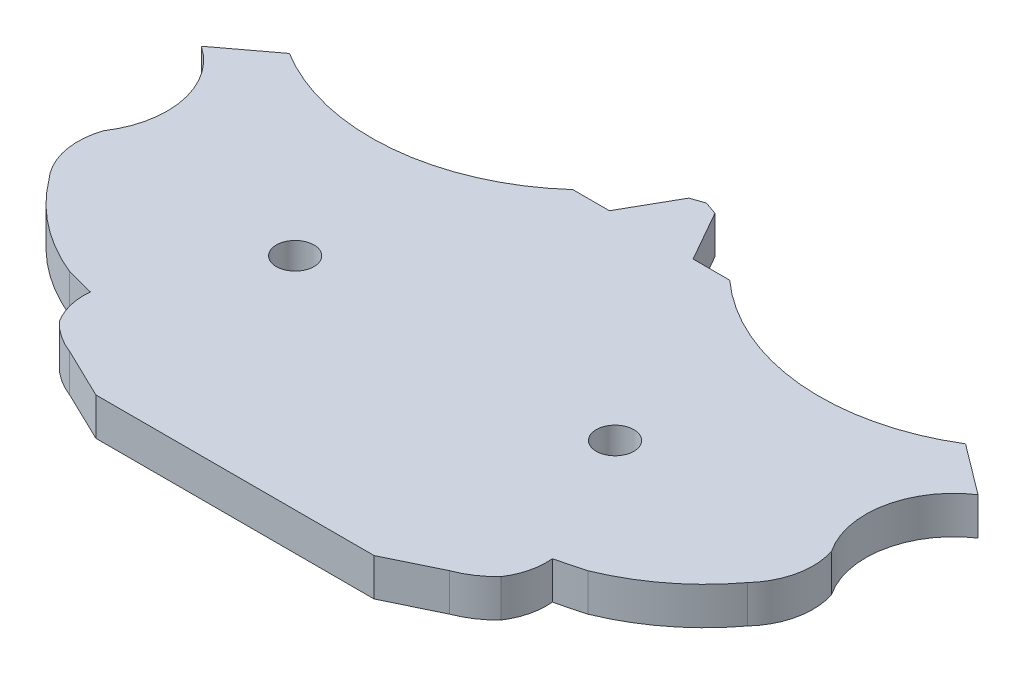
ISO-10303-21;
HEADER;
FILE_DESCRIPTION(('STEP AP214'),'2;1');
FILE_NAME('part.step','',(''),(''),'','','');
FILE_SCHEMA(('AUTOMOTIVE_DESIGN { 1 0 10303 214 1 1 1 1 }'));
ENDSEC;
DATA;
#1=APPLICATION_CONTEXT('core data for automotive mechanical design processes');
#2=APPLICATION_PROTOCOL_DEFINITION('international standard','automotive_design',2000,#1);
#3=PRODUCT_CONTEXT('',#1,'mechanical');
#4=PRODUCT('Part','Part','',(#3));
#5=PRODUCT_RELATED_PRODUCT_CATEGORY('part','',(#4));
#6=PRODUCT_DEFINITION_FORMATION('','',#4);
#7=PRODUCT_DEFINITION_CONTEXT('part definition',#1,'design');
#8=PRODUCT_DEFINITION('design','',#6,#7);
#9=PRODUCT_DEFINITION_SHAPE('','',#8);
#10=(LENGTH_UNIT() NAMED_UNIT(*) SI_UNIT(.MILLI.,.METRE.));
#11=(NAMED_UNIT(*) PLANE_ANGLE_UNIT() SI_UNIT($,.RADIAN.));
#12=(NAMED_UNIT(*) SI_UNIT($,.STERADIAN.) SOLID_ANGLE_UNIT());
#13=UNCERTAINTY_MEASURE_WITH_UNIT(LENGTH_MEASURE(1.E-05),#10,'distance_accuracy_value','');
#14=(GEOMETRIC_REPRESENTATION_CONTEXT(3) GLOBAL_UNCERTAINTY_ASSIGNED_CONTEXT((#13)) GLOBAL_UNIT_ASSIGNED_CONTEXT((#10,
#11,#12)) REPRESENTATION_CONTEXT('',''));
#15=CARTESIAN_POINT('',(0.,0.,0.));
#16=DIRECTION('',(0.,0.,1.));
#17=DIRECTION('',(1.,0.,0.));
#18=AXIS2_PLACEMENT_3D('',#15,#16,#17);
#19=CARTESIAN_POINT('',(-11.9681457477177,3.,24.5135034827843));
#20=DIRECTION('',(0.435219585741613,0.,-0.900324337217927));
#21=DIRECTION('',(-0.900324337217927,0.,-0.435219585741613));
#22=AXIS2_PLACEMENT_3D('',#19,#20,#21);
#23=PLANE('',#22);
#24=DIRECTION('',(0.900324337217927,0.,0.435219585741613));
#25=VECTOR('',#24,1.);
#26=CARTESIAN_POINT('',(-11.9681457477177,-1.,24.5135034827843));
#27=LINE('',#26,#25);
#28=CARTESIAN_POINT('',(-20.1802491308316,-1.,20.5437471575135));
#29=VERTEX_POINT('',#28);
#30=CARTESIAN_POINT('',(-14.7831965238283,-1.,23.1526991792971));
#31=VERTEX_POINT('',#30);
#32=EDGE_CURVE('E246',#29,#31,#27,.T.);
#33=ORIENTED_EDGE('',*,*,#32,.T.);
#34=DIRECTION('',(0.,-1.,0.));
#35=VECTOR('',#34,1.);
#36=CARTESIAN_POINT('',(-14.7831965238283,3.,23.1526991792971));
#37=LINE('',#36,#35);
#38=CARTESIAN_POINT('',(-14.7831965238283,3.,23.1526991792971));
#39=VERTEX_POINT('',#38);
#40=EDGE_CURVE('E11',#39,#31,#37,.T.);
#41=ORIENTED_EDGE('',*,*,#40,.F.);
#42=DIRECTION('',(0.900324337217927,0.,0.435219585741613));
#43=VECTOR('',#42,1.);
#44=CARTESIAN_POINT('',(-11.9681457477177,3.,24.5135034827843));
#45=LINE('',#44,#43);
#46=CARTESIAN_POINT('',(-20.1802491308316,3.,20.5437471575135));
#47=VERTEX_POINT('',#46);
#48=EDGE_CURVE('E315',#47,#39,#45,.T.);
#49=ORIENTED_EDGE('',*,*,#48,.F.);
#50=DIRECTION('',(0.,-1.,0.));
#51=VECTOR('',#50,1.);
#52=CARTESIAN_POINT('',(-20.1802491308316,3.,20.5437471575135));
#53=LINE('',#52,#51);
#54=EDGE_CURVE('E245',#47,#29,#53,.T.);
#55=ORIENTED_EDGE('',*,*,#54,.T.);
#56=EDGE_LOOP('',(#33,#41,#49,#55));
#57=FACE_BOUND('',#56,.T.);
#58=ADVANCED_FACE('F41',(#57),#23,.F.);
#59=CARTESIAN_POINT('',(0.,3.,23.1526991792971));
#60=DIRECTION('',(0.,0.,-1.));
#61=DIRECTION('',(-1.,0.,0.));
#62=AXIS2_PLACEMENT_3D('',#59,#60,#61);
#63=PLANE('',#62);
#64=DIRECTION('',(1.,0.,0.));
#65=VECTOR('',#64,1.);
#66=CARTESIAN_POINT('',(0.,-1.,23.1526991792971));
#67=LINE('',#66,#65);
#68=CARTESIAN_POINT('',(14.7831965238283,-1.,23.1526991792971));
#69=VERTEX_POINT('',#68);
#70=EDGE_CURVE('E249',#31,#69,#67,.T.);
#71=ORIENTED_EDGE('',*,*,#70,.T.);
#72=DIRECTION('',(0.,-1.,0.));
#73=VECTOR('',#72,1.);
#74=CARTESIAN_POINT('',(14.7831965238283,3.,23.1526991792971));
#75=LINE('',#74,#73);
#76=CARTESIAN_POINT('',(14.7831965238283,3.,23.1526991792971));
#77=VERTEX_POINT('',#76);
#78=EDGE_CURVE('E49',#77,#69,#75,.T.);
#79=ORIENTED_EDGE('',*,*,#78,.F.);
#80=DIRECTION('',(1.,0.,0.));
#81=VECTOR('',#80,1.);
#82=CARTESIAN_POINT('',(0.,3.,23.1526991792971));
#83=LINE('',#82,#81);
#84=EDGE_CURVE('E151',#39,#77,#83,.T.);
#85=ORIENTED_EDGE('',*,*,#84,.F.);
#86=ORIENTED_EDGE('',*,*,#40,.T.);
#87=EDGE_LOOP('',(#71,#79,#85,#86));
#88=FACE_BOUND('',#87,.T.);
#89=ADVANCED_FACE('F365',(#88),#63,.F.);
#90=CARTESIAN_POINT('',(11.9681457477177,3.,24.5135034827843));
#91=DIRECTION('',(0.435219585741613,0.,0.900324337217927));
#92=DIRECTION('',(0.900324337217927,0.,-0.435219585741613));
#93=AXIS2_PLACEMENT_3D('',#90,#91,#92);
#94=PLANE('',#93);
#95=DIRECTION('',(-0.900324337217927,0.,0.435219585741613));
#96=VECTOR('',#95,1.);
#97=CARTESIAN_POINT('',(11.9681457477177,-1.,24.5135034827843));
#98=LINE('',#97,#96);
#99=CARTESIAN_POINT('',(20.1802491308316,-1.,20.5437471575135));
#100=VERTEX_POINT('',#99);
#101=EDGE_CURVE('E252',#100,#69,#98,.T.);
#102=ORIENTED_EDGE('',*,*,#101,.F.);
#103=DIRECTION('',(0.,-1.,0.));
#104=VECTOR('',#103,1.);
#105=CARTESIAN_POINT('',(20.1802491308316,3.,20.5437471575135));
#106=LINE('',#105,#104);
#107=CARTESIAN_POINT('',(20.1802491308316,3.,20.5437471575135));
#108=VERTEX_POINT('',#107);
#109=EDGE_CURVE('E358',#108,#100,#106,.T.);
#110=ORIENTED_EDGE('',*,*,#109,.F.);
#111=DIRECTION('',(-0.900324337217927,0.,0.435219585741613));
#112=VECTOR('',#111,1.);
#113=CARTESIAN_POINT('',(11.9681457477177,3.,24.5135034827843));
#114=LINE('',#113,#112);
#115=EDGE_CURVE('E364',#108,#77,#114,.T.);
#116=ORIENTED_EDGE('',*,*,#115,.T.);
#117=ORIENTED_EDGE('',*,*,#78,.T.);
#118=EDGE_LOOP('',(#102,#110,#116,#117));
#119=FACE_BOUND('',#118,.T.);
#120=ADVANCED_FACE('F362',(#119),#94,.T.);
#121=CARTESIAN_POINT('',(17.0103360766643,3.,12.2199800845616));
#122=DIRECTION('',(0.,-1.,0.));
#123=DIRECTION('',(0.,0.,-1.));
#124=AXIS2_PLACEMENT_3D('',#121,#122,#123);
#125=CYLINDRICAL_SURFACE('',#124,8.90693252785372);
#126=CARTESIAN_POINT('',(17.0103360766643,-1.,12.2199800845616));
#127=DIRECTION('',(0.,1.,0.));
#128=DIRECTION('',(0.,0.,1.));
#129=AXIS2_PLACEMENT_3D('',#126,#127,#128);
#130=CIRCLE('',#129,8.90693252785372);
#131=CARTESIAN_POINT('',(23.4746160462479,-1.,18.3475025472359));
#132=VERTEX_POINT('',#131);
#133=EDGE_CURVE('E255',#132,#100,#130,.F.);
#134=ORIENTED_EDGE('',*,*,#133,.F.);
#135=DIRECTION('',(0.,-1.,0.));
#136=VECTOR('',#135,1.);
#137=CARTESIAN_POINT('',(23.4746160462479,3.,18.3475025472359));
#138=LINE('',#137,#136);
#139=CARTESIAN_POINT('',(23.4746160462479,3.,18.3475025472359));
#140=VERTEX_POINT('',#139);
#141=EDGE_CURVE('E356',#140,#132,#138,.T.);
#142=ORIENTED_EDGE('',*,*,#141,.F.);
#143=CARTESIAN_POINT('',(17.0103360766643,3.,12.2199800845616));
#144=DIRECTION('',(0.,1.,0.));
#145=DIRECTION('',(0.,0.,1.));
#146=AXIS2_PLACEMENT_3D('',#143,#144,#145);
#147=CIRCLE('',#146,8.90693252785372);
#148=EDGE_CURVE('E377',#140,#108,#147,.F.);
#149=ORIENTED_EDGE('',*,*,#148,.T.);
#150=ORIENTED_EDGE('',*,*,#109,.T.);
#151=EDGE_LOOP('',(#134,#142,#149,#150));
#152=FACE_BOUND('',#151,.T.);
#153=ADVANCED_FACE('F374',(#152),#125,.T.);
#154=CARTESIAN_POINT('',(17.7774119070791,3.,14.6204026335406));
#155=DIRECTION('',(0.,-1.,0.));
#156=DIRECTION('',(0.,0.,-1.));
#157=AXIS2_PLACEMENT_3D('',#154,#155,#156);
#158=CYLINDRICAL_SURFACE('',#157,6.80804000943221);
#159=CARTESIAN_POINT('',(17.7774119070791,-1.,14.6204026335406));
#160=DIRECTION('',(0.,1.,0.));
#161=DIRECTION('',(0.,0.,1.));
#162=AXIS2_PLACEMENT_3D('',#159,#160,#161);
#163=CIRCLE('',#162,6.80804000943221);
#164=CARTESIAN_POINT('',(24.55337257074,-1.,13.960276998112));
#165=VERTEX_POINT('',#164);
#166=EDGE_CURVE('E258',#165,#132,#163,.F.);
#167=ORIENTED_EDGE('',*,*,#166,.F.);
#168=DIRECTION('',(0.,-1.,0.));
#169=VECTOR('',#168,1.);
#170=CARTESIAN_POINT('',(24.55337257074,3.,13.960276998112));
#171=LINE('',#170,#169);
#172=CARTESIAN_POINT('',(24.55337257074,3.,13.960276998112));
#173=VERTEX_POINT('',#172);
#174=EDGE_CURVE('E354',#173,#165,#171,.T.);
#175=ORIENTED_EDGE('',*,*,#174,.F.);
#176=CARTESIAN_POINT('',(17.7774119070791,3.,14.6204026335406));
#177=DIRECTION('',(0.,1.,0.));
#178=DIRECTION('',(0.,0.,1.));
#179=AXIS2_PLACEMENT_3D('',#176,#177,#178);
#180=CIRCLE('',#179,6.80804000943221);
#181=EDGE_CURVE('E381',#173,#140,#180,.F.);
#182=ORIENTED_EDGE('',*,*,#181,.T.);
#183=ORIENTED_EDGE('',*,*,#141,.T.);
#184=EDGE_LOOP('',(#167,#175,#182,#183));
#185=FACE_BOUND('',#184,.T.);
#186=ADVANCED_FACE('F464',(#185),#158,.T.);
#187=CARTESIAN_POINT('',(9.25185208114312,3.,-51.2936429432652));
#188=DIRECTION('',(0.,-1.,0.));
#189=DIRECTION('',(0.,0.,-1.));
#190=AXIS2_PLACEMENT_3D('',#187,#188,#189);
#191=CYLINDRICAL_SURFACE('',#190,67.0239553966284);
#192=CARTESIAN_POINT('',(9.25185208114312,-1.,-51.2936429432652));
#193=DIRECTION('',(0.,1.,0.));
#194=DIRECTION('',(0.,0.,1.));
#195=AXIS2_PLACEMENT_3D('',#192,#193,#194);
#196=CIRCLE('',#195,67.0239553966284);
#197=CARTESIAN_POINT('',(27.5662579793674,-1.,13.1795540738233));
#198=VERTEX_POINT('',#197);
#199=EDGE_CURVE('E261',#198,#165,#196,.F.);
#200=ORIENTED_EDGE('',*,*,#199,.F.);
#201=DIRECTION('',(0.,-1.,0.));
#202=VECTOR('',#201,1.);
#203=CARTESIAN_POINT('',(27.5662579793674,3.,13.1795540738233));
#204=LINE('',#203,#202);
#205=CARTESIAN_POINT('',(27.5662579793674,3.,13.1795540738233));
#206=VERTEX_POINT('',#205);
#207=EDGE_CURVE('E352',#206,#198,#204,.T.);
#208=ORIENTED_EDGE('',*,*,#207,.F.);
#209=CARTESIAN_POINT('',(9.25185208114312,3.,-51.2936429432652));
#210=DIRECTION('',(0.,1.,0.));
#211=DIRECTION('',(0.,0.,1.));
#212=AXIS2_PLACEMENT_3D('',#209,#210,#211);
#213=CIRCLE('',#212,67.0239553966284);
#214=EDGE_CURVE('E387',#206,#173,#213,.F.);
#215=ORIENTED_EDGE('',*,*,#214,.T.);
#216=ORIENTED_EDGE('',*,*,#174,.T.);
#217=EDGE_LOOP('',(#200,#208,#215,#216));
#218=FACE_BOUND('',#217,.T.);
#219=ADVANCED_FACE('F467',(#218),#191,.T.);
#220=CARTESIAN_POINT('',(18.9970102692638,3.,-7.78102636035583));
#221=DIRECTION('',(0.,-1.,0.));
#222=DIRECTION('',(0.,0.,-1.));
#223=AXIS2_PLACEMENT_3D('',#220,#221,#222);
#224=CYLINDRICAL_SURFACE('',#223,22.6446006468387);
#225=CARTESIAN_POINT('',(18.9970102692638,-1.,-7.78102636035583));
#226=DIRECTION('',(0.,1.,0.));
#227=DIRECTION('',(0.,0.,1.));
#228=AXIS2_PLACEMENT_3D('',#225,#226,#227);
#229=CIRCLE('',#228,22.6446006468387);
#230=CARTESIAN_POINT('',(37.1179234229745,-1.,5.79875437905528));
#231=VERTEX_POINT('',#230);
#232=EDGE_CURVE('E264',#231,#198,#229,.F.);
#233=ORIENTED_EDGE('',*,*,#232,.F.);
#234=DIRECTION('',(0.,-1.,0.));
#235=VECTOR('',#234,1.);
#236=CARTESIAN_POINT('',(37.1179234229745,3.,5.79875437905528));
#237=LINE('',#236,#235);
#238=CARTESIAN_POINT('',(37.1179234229745,3.,5.79875437905528));
#239=VERTEX_POINT('',#238);
#240=EDGE_CURVE('E350',#239,#231,#237,.T.);
#241=ORIENTED_EDGE('',*,*,#240,.F.);
#242=CARTESIAN_POINT('',(18.9970102692638,3.,-7.78102636035583));
#243=DIRECTION('',(0.,1.,0.));
#244=DIRECTION('',(0.,0.,1.));
#245=AXIS2_PLACEMENT_3D('',#242,#243,#244);
#246=CIRCLE('',#245,22.6446006468387);
#247=EDGE_CURVE('E390',#239,#206,#246,.F.);
#248=ORIENTED_EDGE('',*,*,#247,.T.);
#249=ORIENTED_EDGE('',*,*,#207,.T.);
#250=EDGE_LOOP('',(#233,#241,#248,#249));
#251=FACE_BOUND('',#250,.T.);
#252=ADVANCED_FACE('F471',(#251),#224,.T.);
#253=CARTESIAN_POINT('',(31.6399917117448,3.,0.775734258309484));
#254=DIRECTION('',(0.,-1.,0.));
#255=DIRECTION('',(0.,0.,-1.));
#256=AXIS2_PLACEMENT_3D('',#253,#254,#255);
#257=CYLINDRICAL_SURFACE('',#256,7.43225853737031);
#258=CARTESIAN_POINT('',(31.6399917117448,-1.,0.775734258309484));
#259=DIRECTION('',(0.,1.,0.));
#260=DIRECTION('',(0.,0.,1.));
#261=AXIS2_PLACEMENT_3D('',#258,#259,#260);
#262=CIRCLE('',#261,7.43225853737031);
#263=CARTESIAN_POINT('',(38.692235530154,-1.,-1.57039533999114));
#264=VERTEX_POINT('',#263);
#265=EDGE_CURVE('E267',#264,#231,#262,.F.);
#266=ORIENTED_EDGE('',*,*,#265,.F.);
#267=DIRECTION('',(0.,-1.,0.));
#268=VECTOR('',#267,1.);
#269=CARTESIAN_POINT('',(38.692235530154,3.,-1.57039533999114));
#270=LINE('',#269,#268);
#271=CARTESIAN_POINT('',(38.692235530154,3.,-1.57039533999114));
#272=VERTEX_POINT('',#271);
#273=EDGE_CURVE('E348',#272,#264,#270,.T.);
#274=ORIENTED_EDGE('',*,*,#273,.F.);
#275=CARTESIAN_POINT('',(31.6399917117448,3.,0.775734258309484));
#276=DIRECTION('',(0.,1.,0.));
#277=DIRECTION('',(0.,0.,1.));
#278=AXIS2_PLACEMENT_3D('',#275,#276,#277);
#279=CIRCLE('',#278,7.43225853737031);
#280=EDGE_CURVE('E393',#272,#239,#279,.F.);
#281=ORIENTED_EDGE('',*,*,#280,.T.);
#282=ORIENTED_EDGE('',*,*,#240,.T.);
#283=EDGE_LOOP('',(#266,#274,#281,#282));
#284=FACE_BOUND('',#283,.T.);
#285=ADVANCED_FACE('F475',(#284),#257,.T.);
#286=CARTESIAN_POINT('',(46.4728637491519,3.,-6.76430841435745));
#287=DIRECTION('',(0.,-1.,0.));
#288=DIRECTION('',(0.,0.,-1.));
#289=AXIS2_PLACEMENT_3D('',#286,#287,#288);
#290=CYLINDRICAL_SURFACE('',#289,9.35494032617735);
#291=CARTESIAN_POINT('',(46.4728637491519,-1.,-6.76430841435745));
#292=DIRECTION('',(0.,1.,0.));
#293=DIRECTION('',(0.,0.,1.));
#294=AXIS2_PLACEMENT_3D('',#291,#292,#293);
#295=CIRCLE('',#294,9.35494032617735);
#296=CARTESIAN_POINT('',(41.2789506747852,-1.,-14.5449366333551));
#297=VERTEX_POINT('',#296);
#298=EDGE_CURVE('E270',#297,#264,#295,.T.);
#299=ORIENTED_EDGE('',*,*,#298,.F.);
#300=DIRECTION('',(0.,-1.,0.));
#301=VECTOR('',#300,1.);
#302=CARTESIAN_POINT('',(41.2789506747852,3.,-14.5449366333551));
#303=LINE('',#302,#301);
#304=CARTESIAN_POINT('',(41.2789506747852,3.,-14.5449366333551));
#305=VERTEX_POINT('',#304);
#306=EDGE_CURVE('E346',#305,#297,#303,.T.);
#307=ORIENTED_EDGE('',*,*,#306,.F.);
#308=CARTESIAN_POINT('',(46.4728637491519,3.,-6.76430841435745));
#309=DIRECTION('',(0.,1.,0.));
#310=DIRECTION('',(0.,0.,1.));
#311=AXIS2_PLACEMENT_3D('',#308,#309,#310);
#312=CIRCLE('',#311,9.35494032617735);
#313=EDGE_CURVE('E396',#305,#272,#312,.T.);
#314=ORIENTED_EDGE('',*,*,#313,.T.);
#315=ORIENTED_EDGE('',*,*,#273,.T.);
#316=EDGE_LOOP('',(#299,#307,#314,#315));
#317=FACE_BOUND('',#316,.T.);
#318=ADVANCED_FACE('F479',(#317),#290,.F.);
#319=CARTESIAN_POINT('',(21.7826576918409,3.,-29.2077467613805));
#320=DIRECTION('',(-0.601064363897763,0.,0.799200619652023));
#321=DIRECTION('',(0.799200619652023,0.,0.601064363897763));
#322=AXIS2_PLACEMENT_3D('',#319,#320,#321);
#323=PLANE('',#322);
#324=DIRECTION('',(-0.799200619652023,0.,-0.601064363897763));
#325=VECTOR('',#324,1.);
#326=CARTESIAN_POINT('',(21.7826576918409,-1.,-29.2077467613805));
#327=LINE('',#326,#325);
#328=CARTESIAN_POINT('',(35.9347751021454,-1.,-18.5641946420955));
#329=VERTEX_POINT('',#328);
#330=EDGE_CURVE('E273',#297,#329,#327,.T.);
#331=ORIENTED_EDGE('',*,*,#330,.T.);
#332=DIRECTION('',(0.,-1.,0.));
#333=VECTOR('',#332,1.);
#334=CARTESIAN_POINT('',(35.9347751021454,3.,-18.5641946420955));
#335=LINE('',#334,#333);
#336=CARTESIAN_POINT('',(35.9347751021454,3.,-18.5641946420955));
#337=VERTEX_POINT('',#336);
#338=EDGE_CURVE('E344',#337,#329,#335,.T.);
#339=ORIENTED_EDGE('',*,*,#338,.F.);
#340=DIRECTION('',(-0.799200619652023,0.,-0.601064363897763));
#341=VECTOR('',#340,1.);
#342=CARTESIAN_POINT('',(21.7826576918409,3.,-29.2077467613805));
#343=LINE('',#342,#341);
#344=EDGE_CURVE('E399',#305,#337,#343,.T.);
#345=ORIENTED_EDGE('',*,*,#344,.F.);
#346=ORIENTED_EDGE('',*,*,#306,.T.);
#347=EDGE_LOOP('',(#331,#339,#345,#346));
#348=FACE_BOUND('',#347,.T.);
#349=ADVANCED_FACE('F483',(#348),#323,.F.);
#350=CARTESIAN_POINT('',(23.8296768106751,3.,-38.298367354192));
#351=DIRECTION('',(0.,-1.,0.));
#352=DIRECTION('',(0.,0.,-1.));
#353=AXIS2_PLACEMENT_3D('',#350,#351,#352);
#354=CYLINDRICAL_SURFACE('',#353,23.151047001745);
#355=CARTESIAN_POINT('',(23.8296768106751,-1.,-38.298367354192));
#356=DIRECTION('',(0.,1.,0.));
#357=DIRECTION('',(0.,0.,1.));
#358=AXIS2_PLACEMENT_3D('',#355,#356,#357);
#359=CIRCLE('',#358,23.151047001745);
#360=CARTESIAN_POINT('',(8.33896874436669,-1.,-21.0934569829807));
#361=VERTEX_POINT('',#360);
#362=EDGE_CURVE('E276',#361,#329,#359,.T.);
#363=ORIENTED_EDGE('',*,*,#362,.F.);
#364=DIRECTION('',(0.,-1.,0.));
#365=VECTOR('',#364,1.);
#366=CARTESIAN_POINT('',(8.33896874436669,3.,-21.0934569829807));
#367=LINE('',#366,#365);
#368=CARTESIAN_POINT('',(8.33896874436669,3.,-21.0934569829807));
#369=VERTEX_POINT('',#368);
#370=EDGE_CURVE('E342',#369,#361,#367,.T.);
#371=ORIENTED_EDGE('',*,*,#370,.F.);
#372=CARTESIAN_POINT('',(23.8296768106751,3.,-38.298367354192));
#373=DIRECTION('',(0.,1.,0.));
#374=DIRECTION('',(0.,0.,1.));
#375=AXIS2_PLACEMENT_3D('',#372,#373,#374);
#376=CIRCLE('',#375,23.151047001745);
#377=EDGE_CURVE('E401',#369,#337,#376,.T.);
#378=ORIENTED_EDGE('',*,*,#377,.T.);
#379=ORIENTED_EDGE('',*,*,#338,.T.);
#380=EDGE_LOOP('',(#363,#371,#378,#379));
#381=FACE_BOUND('',#380,.T.);
#382=ADVANCED_FACE('F487',(#381),#354,.F.);
#383=CARTESIAN_POINT('',(0.,3.,-21.0934569829807));
#384=DIRECTION('',(0.,0.,-1.));
#385=DIRECTION('',(-1.,0.,0.));
#386=AXIS2_PLACEMENT_3D('',#383,#384,#385);
#387=PLANE('',#386);
#388=DIRECTION('',(1.,0.,0.));
#389=VECTOR('',#388,1.);
#390=CARTESIAN_POINT('',(0.,-1.,-21.0934569829807));
#391=LINE('',#390,#389);
#392=CARTESIAN_POINT('',(4.44827769626541,-1.,-21.0934569829807));
#393=VERTEX_POINT('',#392);
#394=EDGE_CURVE('E279',#393,#361,#391,.T.);
#395=ORIENTED_EDGE('',*,*,#394,.F.);
#396=DIRECTION('',(0.,-1.,0.));
#397=VECTOR('',#396,1.);
#398=CARTESIAN_POINT('',(4.44827769626541,3.,-21.0934569829807));
#399=LINE('',#398,#397);
#400=CARTESIAN_POINT('',(4.44827769626541,3.,-21.0934569829807));
#401=VERTEX_POINT('',#400);
#402=EDGE_CURVE('E340',#401,#393,#399,.T.);
#403=ORIENTED_EDGE('',*,*,#402,.F.);
#404=DIRECTION('',(1.,0.,0.));
#405=VECTOR('',#404,1.);
#406=CARTESIAN_POINT('',(0.,3.,-21.0934569829807));
#407=LINE('',#406,#405);
#408=EDGE_CURVE('E404',#401,#369,#407,.T.);
#409=ORIENTED_EDGE('',*,*,#408,.T.);
#410=ORIENTED_EDGE('',*,*,#370,.T.);
#411=EDGE_LOOP('',(#395,#403,#409,#410));
#412=FACE_BOUND('',#411,.T.);
#413=ADVANCED_FACE('F491',(#412),#387,.T.);
#414=CARTESIAN_POINT('',(12.3165672492831,3.,-7.23998356663598));
#415=DIRECTION('',(-0.869537482646765,0.,0.493866951994489));
#416=DIRECTION('',(0.493866951994489,0.,0.869537482646765));
#417=AXIS2_PLACEMENT_3D('',#414,#415,#416);
#418=PLANE('',#417);
#419=DIRECTION('',(-0.493866951994489,0.,-0.869537482646765));
#420=VECTOR('',#419,1.);
#421=CARTESIAN_POINT('',(12.3165672492831,-1.,-7.23998356663598));
#422=LINE('',#421,#420);
#423=CARTESIAN_POINT('',(1.39220905189552,-1.,-26.4741900429461));
#424=VERTEX_POINT('',#423);
#425=EDGE_CURVE('E282',#393,#424,#422,.T.);
#426=ORIENTED_EDGE('',*,*,#425,.T.);
#427=DIRECTION('',(0.,-1.,0.));
#428=VECTOR('',#427,1.);
#429=CARTESIAN_POINT('',(1.39220905189552,3.,-26.4741900429461));
#430=LINE('',#429,#428);
#431=CARTESIAN_POINT('',(1.39220905189552,3.,-26.4741900429461));
#432=VERTEX_POINT('',#431);
#433=EDGE_CURVE('E337',#432,#424,#430,.T.);
#434=ORIENTED_EDGE('',*,*,#433,.F.);
#435=DIRECTION('',(-0.493866951994489,0.,-0.869537482646765));
#436=VECTOR('',#435,1.);
#437=CARTESIAN_POINT('',(12.3165672492831,3.,-7.23998356663598));
#438=LINE('',#437,#436);
#439=EDGE_CURVE('E407',#401,#432,#438,.T.);
#440=ORIENTED_EDGE('',*,*,#439,.F.);
#441=ORIENTED_EDGE('',*,*,#402,.T.);
#442=EDGE_LOOP('',(#426,#434,#440,#441));
#443=FACE_BOUND('',#442,.T.);
#444=ADVANCED_FACE('F493',(#443),#418,.F.);
#445=CARTESIAN_POINT('',(8.31902601269563,3.,-24.053948330763));
#446=DIRECTION('',(-0.329847212168242,0.,0.944034330215188));
#447=DIRECTION('',(0.944034330215188,0.,0.329847212168242));
#448=AXIS2_PLACEMENT_3D('',#445,#446,#447);
#449=PLANE('',#448);
#450=DIRECTION('',(-0.944034330215188,0.,-0.329847212168242));
#451=VECTOR('',#450,1.);
#452=CARTESIAN_POINT('',(8.31902601269563,-1.,-24.053948330763));
#453=LINE('',#452,#451);
#454=CARTESIAN_POINT('',(0.,-1.,-26.9606302706214));
#455=VERTEX_POINT('',#454);
#456=EDGE_CURVE('E285',#424,#455,#453,.T.);
#457=ORIENTED_EDGE('',*,*,#456,.T.);
#458=DIRECTION('',(0.,-1.,0.));
#459=VECTOR('',#458,1.);
#460=CARTESIAN_POINT('',(0.,3.,-26.9606302706214));
#461=LINE('',#460,#459);
#462=CARTESIAN_POINT('',(0.,3.,-26.9606302706214));
#463=VERTEX_POINT('',#462);
#464=EDGE_CURVE('E335',#463,#455,#461,.T.);
#465=ORIENTED_EDGE('',*,*,#464,.F.);
#466=DIRECTION('',(-0.944034330215188,0.,-0.329847212168242));
#467=VECTOR('',#466,1.);
#468=CARTESIAN_POINT('',(8.31902601269563,3.,-24.053948330763));
#469=LINE('',#468,#467);
#470=EDGE_CURVE('E410',#432,#463,#469,.T.);
#471=ORIENTED_EDGE('',*,*,#470,.F.);
#472=ORIENTED_EDGE('',*,*,#433,.T.);
#473=EDGE_LOOP('',(#457,#465,#471,#472));
#474=FACE_BOUND('',#473,.T.);
#475=ADVANCED_FACE('F496',(#474),#449,.F.);
#476=CARTESIAN_POINT('',(-8.31902601269563,3.,-24.053948330763));
#477=DIRECTION('',(-0.329847212168242,0.,-0.944034330215188));
#478=DIRECTION('',(-0.944034330215188,0.,0.329847212168242));
#479=AXIS2_PLACEMENT_3D('',#476,#477,#478);
#480=PLANE('',#479);
#481=DIRECTION('',(0.944034330215188,0.,-0.329847212168242));
#482=VECTOR('',#481,1.);
#483=CARTESIAN_POINT('',(-8.31902601269563,-1.,-24.053948330763));
#484=LINE('',#483,#482);
#485=CARTESIAN_POINT('',(-1.39220905189553,-1.,-26.4741900429461));
#486=VERTEX_POINT('',#485);
#487=EDGE_CURVE('E288',#486,#455,#484,.T.);
#488=ORIENTED_EDGE('',*,*,#487,.F.);
#489=DIRECTION('',(0.,-1.,0.));
#490=VECTOR('',#489,1.);
#491=CARTESIAN_POINT('',(-1.39220905189553,3.,-26.4741900429461));
#492=LINE('',#491,#490);
#493=CARTESIAN_POINT('',(-1.39220905189553,3.,-26.4741900429461));
#494=VERTEX_POINT('',#493);
#495=EDGE_CURVE('E333',#494,#486,#492,.T.);
#496=ORIENTED_EDGE('',*,*,#495,.F.);
#497=DIRECTION('',(0.944034330215188,0.,-0.329847212168242));
#498=VECTOR('',#497,1.);
#499=CARTESIAN_POINT('',(-8.31902601269563,3.,-24.053948330763));
#500=LINE('',#499,#498);
#501=EDGE_CURVE('E412',#494,#463,#500,.T.);
#502=ORIENTED_EDGE('',*,*,#501,.T.);
#503=ORIENTED_EDGE('',*,*,#464,.T.);
#504=EDGE_LOOP('',(#488,#496,#502,#503));
#505=FACE_BOUND('',#504,.T.);
#506=ADVANCED_FACE('F500',(#505),#480,.T.);
#507=CARTESIAN_POINT('',(-12.3165672492831,3.,-7.239983566636));
#508=DIRECTION('',(-0.869537482646764,0.,-0.49386695199449));
#509=DIRECTION('',(-0.49386695199449,0.,0.869537482646764));
#510=AXIS2_PLACEMENT_3D('',#507,#508,#509);
#511=PLANE('',#510);
#512=DIRECTION('',(0.49386695199449,0.,-0.869537482646764));
#513=VECTOR('',#512,1.);
#514=CARTESIAN_POINT('',(-12.3165672492831,-1.,-7.239983566636));
#515=LINE('',#514,#513);
#516=CARTESIAN_POINT('',(-4.44827769626543,-1.,-21.0934569829807));
#517=VERTEX_POINT('',#516);
#518=EDGE_CURVE('E291',#517,#486,#515,.T.);
#519=ORIENTED_EDGE('',*,*,#518,.F.);
#520=DIRECTION('',(0.,-1.,0.));
#521=VECTOR('',#520,1.);
#522=CARTESIAN_POINT('',(-4.44827769626543,3.,-21.0934569829807));
#523=LINE('',#522,#521);
#524=CARTESIAN_POINT('',(-4.44827769626543,3.,-21.0934569829807));
#525=VERTEX_POINT('',#524);
#526=EDGE_CURVE('E331',#525,#517,#523,.T.);
#527=ORIENTED_EDGE('',*,*,#526,.F.);
#528=DIRECTION('',(0.49386695199449,0.,-0.869537482646764));
#529=VECTOR('',#528,1.);
#530=CARTESIAN_POINT('',(-12.3165672492831,3.,-7.239983566636));
#531=LINE('',#530,#529);
#532=EDGE_CURVE('E415',#525,#494,#531,.T.);
#533=ORIENTED_EDGE('',*,*,#532,.T.);
#534=ORIENTED_EDGE('',*,*,#495,.T.);
#535=EDGE_LOOP('',(#519,#527,#533,#534));
#536=FACE_BOUND('',#535,.T.);
#537=ADVANCED_FACE('F504',(#536),#511,.T.);
#538=CARTESIAN_POINT('',(-8.33896874436671,-1.,-21.0934569829807));
#539=VERTEX_POINT('',#538);
#540=EDGE_CURVE('E283',#539,#517,#391,.T.);
#541=ORIENTED_EDGE('',*,*,#540,.F.);
#542=DIRECTION('',(0.,-1.,0.));
#543=VECTOR('',#542,1.);
#544=CARTESIAN_POINT('',(-8.33896874436671,3.,-21.0934569829807));
#545=LINE('',#544,#543);
#546=CARTESIAN_POINT('',(-8.33896874436671,3.,-21.0934569829807));
#547=VERTEX_POINT('',#546);
#548=EDGE_CURVE('E329',#547,#539,#545,.T.);
#549=ORIENTED_EDGE('',*,*,#548,.F.);
#550=EDGE_CURVE('E408',#547,#525,#407,.T.);
#551=ORIENTED_EDGE('',*,*,#550,.T.);
#552=ORIENTED_EDGE('',*,*,#526,.T.);
#553=EDGE_LOOP('',(#541,#549,#551,#552));
#554=FACE_BOUND('',#553,.T.);
#555=ADVANCED_FACE('F508',(#554),#387,.T.);
#556=CARTESIAN_POINT('',(-23.8296768106752,3.,-38.298367354192));
#557=DIRECTION('',(0.,-1.,0.));
#558=DIRECTION('',(0.,0.,-1.));
#559=AXIS2_PLACEMENT_3D('',#556,#557,#558);
#560=CYLINDRICAL_SURFACE('',#559,23.151047001745);
#561=CARTESIAN_POINT('',(-23.8296768106752,-1.,-38.298367354192));
#562=DIRECTION('',(0.,1.,0.));
#563=DIRECTION('',(0.,0.,1.));
#564=AXIS2_PLACEMENT_3D('',#561,#562,#563);
#565=CIRCLE('',#564,23.151047001745);
#566=CARTESIAN_POINT('',(-35.9347751021454,-1.,-18.5641946420955));
#567=VERTEX_POINT('',#566);
#568=EDGE_CURVE('E294',#539,#567,#565,.F.);
#569=ORIENTED_EDGE('',*,*,#568,.T.);
#570=DIRECTION('',(0.,-1.,0.));
#571=VECTOR('',#570,1.);
#572=CARTESIAN_POINT('',(-35.9347751021454,3.,-18.5641946420955));
#573=LINE('',#572,#571);
#574=CARTESIAN_POINT('',(-35.9347751021454,3.,-18.5641946420955));
#575=VERTEX_POINT('',#574);
#576=EDGE_CURVE('E327',#575,#567,#573,.T.);
#577=ORIENTED_EDGE('',*,*,#576,.F.);
#578=CARTESIAN_POINT('',(-23.8296768106752,3.,-38.298367354192));
#579=DIRECTION('',(0.,1.,0.));
#580=DIRECTION('',(0.,0.,1.));
#581=AXIS2_PLACEMENT_3D('',#578,#579,#580);
#582=CIRCLE('',#581,23.151047001745);
#583=EDGE_CURVE('E418',#547,#575,#582,.F.);
#584=ORIENTED_EDGE('',*,*,#583,.F.);
#585=ORIENTED_EDGE('',*,*,#548,.T.);
#586=EDGE_LOOP('',(#569,#577,#584,#585));
#587=FACE_BOUND('',#586,.T.);
#588=ADVANCED_FACE('F512',(#587),#560,.F.);
#589=CARTESIAN_POINT('',(-21.7826576918409,3.,-29.2077467613805));
#590=DIRECTION('',(-0.601064363897763,0.,-0.799200619652023));
#591=DIRECTION('',(-0.799200619652023,0.,0.601064363897763));
#592=AXIS2_PLACEMENT_3D('',#589,#590,#591);
#593=PLANE('',#592);
#594=DIRECTION('',(0.799200619652023,0.,-0.601064363897763));
#595=VECTOR('',#594,1.);
#596=CARTESIAN_POINT('',(-21.7826576918409,-1.,-29.2077467613805));
#597=LINE('',#596,#595);
#598=CARTESIAN_POINT('',(-41.2789506747852,-1.,-14.5449366333551));
#599=VERTEX_POINT('',#598);
#600=EDGE_CURVE('E297',#599,#567,#597,.T.);
#601=ORIENTED_EDGE('',*,*,#600,.F.);
#602=DIRECTION('',(0.,-1.,0.));
#603=VECTOR('',#602,1.);
#604=CARTESIAN_POINT('',(-41.2789506747852,3.,-14.5449366333551));
#605=LINE('',#604,#603);
#606=CARTESIAN_POINT('',(-41.2789506747852,3.,-14.5449366333551));
#607=VERTEX_POINT('',#606);
#608=EDGE_CURVE('E325',#607,#599,#605,.T.);
#609=ORIENTED_EDGE('',*,*,#608,.F.);
#610=DIRECTION('',(0.799200619652023,0.,-0.601064363897763));
#611=VECTOR('',#610,1.);
#612=CARTESIAN_POINT('',(-21.7826576918409,3.,-29.2077467613805));
#613=LINE('',#612,#611);
#614=EDGE_CURVE('E420',#607,#575,#613,.T.);
#615=ORIENTED_EDGE('',*,*,#614,.T.);
#616=ORIENTED_EDGE('',*,*,#576,.T.);
#617=EDGE_LOOP('',(#601,#609,#615,#616));
#618=FACE_BOUND('',#617,.T.);
#619=ADVANCED_FACE('F516',(#618),#593,.T.);
#620=CARTESIAN_POINT('',(-46.4728637491519,3.,-6.76430841435745));
#621=DIRECTION('',(0.,-1.,0.));
#622=DIRECTION('',(0.,0.,-1.));
#623=AXIS2_PLACEMENT_3D('',#620,#621,#622);
#624=CYLINDRICAL_SURFACE('',#623,9.35494032617735);
#625=CARTESIAN_POINT('',(-46.4728637491519,-1.,-6.76430841435745));
#626=DIRECTION('',(0.,1.,0.));
#627=DIRECTION('',(0.,0.,1.));
#628=AXIS2_PLACEMENT_3D('',#625,#626,#627);
#629=CIRCLE('',#628,9.35494032617735);
#630=CARTESIAN_POINT('',(-38.692235530154,-1.,-1.57039533999114));
#631=VERTEX_POINT('',#630);
#632=EDGE_CURVE('E300',#599,#631,#629,.F.);
#633=ORIENTED_EDGE('',*,*,#632,.T.);
#634=DIRECTION('',(0.,-1.,0.));
#635=VECTOR('',#634,1.);
#636=CARTESIAN_POINT('',(-38.692235530154,3.,-1.57039533999114));
#637=LINE('',#636,#635);
#638=CARTESIAN_POINT('',(-38.692235530154,3.,-1.57039533999114));
#639=VERTEX_POINT('',#638);
#640=EDGE_CURVE('E322',#639,#631,#637,.T.);
#641=ORIENTED_EDGE('',*,*,#640,.F.);
#642=CARTESIAN_POINT('',(-46.4728637491519,3.,-6.76430841435745));
#643=DIRECTION('',(0.,1.,0.));
#644=DIRECTION('',(0.,0.,1.));
#645=AXIS2_PLACEMENT_3D('',#642,#643,#644);
#646=CIRCLE('',#645,9.35494032617735);
#647=EDGE_CURVE('E423',#607,#639,#646,.F.);
#648=ORIENTED_EDGE('',*,*,#647,.F.);
#649=ORIENTED_EDGE('',*,*,#608,.T.);
#650=EDGE_LOOP('',(#633,#641,#648,#649));
#651=FACE_BOUND('',#650,.T.);
#652=ADVANCED_FACE('F520',(#651),#624,.F.);
#653=CARTESIAN_POINT('',(-31.6399917117448,3.,0.775734258309484));
#654=DIRECTION('',(0.,-1.,0.));
#655=DIRECTION('',(0.,0.,-1.));
#656=AXIS2_PLACEMENT_3D('',#653,#654,#655);
#657=CYLINDRICAL_SURFACE('',#656,7.43225853737031);
#658=CARTESIAN_POINT('',(-31.6399917117448,-1.,0.775734258309484));
#659=DIRECTION('',(0.,1.,0.));
#660=DIRECTION('',(0.,0.,1.));
#661=AXIS2_PLACEMENT_3D('',#658,#659,#660);
#662=CIRCLE('',#661,7.43225853737031);
#663=CARTESIAN_POINT('',(-37.1179234229746,-1.,5.79875437905528));
#664=VERTEX_POINT('',#663);
#665=EDGE_CURVE('E302',#631,#664,#662,.T.);
#666=ORIENTED_EDGE('',*,*,#665,.T.);
#667=DIRECTION('',(0.,-1.,0.));
#668=VECTOR('',#667,1.);
#669=CARTESIAN_POINT('',(-37.1179234229746,3.,5.79875437905528));
#670=LINE('',#669,#668);
#671=CARTESIAN_POINT('',(-37.1179234229746,3.,5.79875437905528));
#672=VERTEX_POINT('',#671);
#673=EDGE_CURVE('E319',#672,#664,#670,.T.);
#674=ORIENTED_EDGE('',*,*,#673,.F.);
#675=CARTESIAN_POINT('',(-31.6399917117448,3.,0.775734258309484));
#676=DIRECTION('',(0.,1.,0.));
#677=DIRECTION('',(0.,0.,1.));
#678=AXIS2_PLACEMENT_3D('',#675,#676,#677);
#679=CIRCLE('',#678,7.43225853737031);
#680=EDGE_CURVE('E425',#639,#672,#679,.T.);
#681=ORIENTED_EDGE('',*,*,#680,.F.);
#682=ORIENTED_EDGE('',*,*,#640,.T.);
#683=EDGE_LOOP('',(#666,#674,#681,#682));
#684=FACE_BOUND('',#683,.T.);
#685=ADVANCED_FACE('F432',(#684),#657,.T.);
#686=CARTESIAN_POINT('',(-18.9970102692638,3.,-7.78102636035583));
#687=DIRECTION('',(0.,-1.,0.));
#688=DIRECTION('',(0.,0.,-1.));
#689=AXIS2_PLACEMENT_3D('',#686,#687,#688);
#690=CYLINDRICAL_SURFACE('',#689,22.6446006468387);
#691=CARTESIAN_POINT('',(-18.9970102692638,-1.,-7.78102636035583));
#692=DIRECTION('',(0.,1.,0.));
#693=DIRECTION('',(0.,0.,1.));
#694=AXIS2_PLACEMENT_3D('',#691,#692,#693);
#695=CIRCLE('',#694,22.6446006468387);
#696=CARTESIAN_POINT('',(-27.5662579793674,-1.,13.1795540738233));
#697=VERTEX_POINT('',#696);
#698=EDGE_CURVE('E304',#664,#697,#695,.T.);
#699=ORIENTED_EDGE('',*,*,#698,.T.);
#700=DIRECTION('',(0.,-1.,0.));
#701=VECTOR('',#700,1.);
#702=CARTESIAN_POINT('',(-27.5662579793674,3.,13.1795540738233));
#703=LINE('',#702,#701);
#704=CARTESIAN_POINT('',(-27.5662579793674,3.,13.1795540738233));
#705=VERTEX_POINT('',#704);
#706=EDGE_CURVE('E231',#705,#697,#703,.T.);
#707=ORIENTED_EDGE('',*,*,#706,.F.);
#708=CARTESIAN_POINT('',(-18.9970102692638,3.,-7.78102636035583));
#709=DIRECTION('',(0.,1.,0.));
#710=DIRECTION('',(0.,0.,1.));
#711=AXIS2_PLACEMENT_3D('',#708,#709,#710);
#712=CIRCLE('',#711,22.6446006468387);
#713=EDGE_CURVE('E222',#672,#705,#712,.T.);
#714=ORIENTED_EDGE('',*,*,#713,.F.);
#715=ORIENTED_EDGE('',*,*,#673,.T.);
#716=EDGE_LOOP('',(#699,#707,#714,#715));
#717=FACE_BOUND('',#716,.T.);
#718=ADVANCED_FACE('F436',(#717),#690,.T.);
#719=CARTESIAN_POINT('',(-9.25185208114313,3.,-51.2936429432652));
#720=DIRECTION('',(0.,-1.,0.));
#721=DIRECTION('',(0.,0.,-1.));
#722=AXIS2_PLACEMENT_3D('',#719,#720,#721);
#723=CYLINDRICAL_SURFACE('',#722,67.0239553966284);
#724=CARTESIAN_POINT('',(-9.25185208114313,-1.,-51.2936429432652));
#725=DIRECTION('',(0.,1.,0.));
#726=DIRECTION('',(0.,0.,1.));
#727=AXIS2_PLACEMENT_3D('',#724,#725,#726);
#728=CIRCLE('',#727,67.0239553966284);
#729=CARTESIAN_POINT('',(-24.55337257074,-1.,13.960276998112));
#730=VERTEX_POINT('',#729);
#731=EDGE_CURVE('E230',#697,#730,#728,.T.);
#732=ORIENTED_EDGE('',*,*,#731,.T.);
#733=DIRECTION('',(0.,-1.,0.));
#734=VECTOR('',#733,1.);
#735=CARTESIAN_POINT('',(-24.55337257074,3.,13.960276998112));
#736=LINE('',#735,#734);
#737=CARTESIAN_POINT('',(-24.55337257074,3.,13.960276998112));
#738=VERTEX_POINT('',#737);
#739=EDGE_CURVE('E227',#738,#730,#736,.T.);
#740=ORIENTED_EDGE('',*,*,#739,.F.);
#741=CARTESIAN_POINT('',(-9.25185208114313,3.,-51.2936429432652));
#742=DIRECTION('',(0.,1.,0.));
#743=DIRECTION('',(0.,0.,1.));
#744=AXIS2_PLACEMENT_3D('',#741,#742,#743);
#745=CIRCLE('',#744,67.0239553966284);
#746=EDGE_CURVE('E215',#705,#738,#745,.T.);
#747=ORIENTED_EDGE('',*,*,#746,.F.);
#748=ORIENTED_EDGE('',*,*,#706,.T.);
#749=EDGE_LOOP('',(#732,#740,#747,#748));
#750=FACE_BOUND('',#749,.T.);
#751=ADVANCED_FACE('F228',(#750),#723,.T.);
#752=CARTESIAN_POINT('',(-17.7774119070792,3.,14.6204026335406));
#753=DIRECTION('',(0.,-1.,0.));
#754=DIRECTION('',(0.,0.,-1.));
#755=AXIS2_PLACEMENT_3D('',#752,#753,#754);
#756=CYLINDRICAL_SURFACE('',#755,6.80804000943221);
#757=CARTESIAN_POINT('',(-17.7774119070792,-1.,14.6204026335406));
#758=DIRECTION('',(0.,1.,0.));
#759=DIRECTION('',(0.,0.,1.));
#760=AXIS2_PLACEMENT_3D('',#757,#758,#759);
#761=CIRCLE('',#760,6.80804000943221);
#762=CARTESIAN_POINT('',(-23.4746160462479,-1.,18.3475025472359));
#763=VERTEX_POINT('',#762);
#764=EDGE_CURVE('E137',#730,#763,#761,.T.);
#765=ORIENTED_EDGE('',*,*,#764,.T.);
#766=DIRECTION('',(0.,-1.,0.));
#767=VECTOR('',#766,1.);
#768=CARTESIAN_POINT('',(-23.4746160462479,3.,18.3475025472359));
#769=LINE('',#768,#767);
#770=CARTESIAN_POINT('',(-23.4746160462479,3.,18.3475025472359));
#771=VERTEX_POINT('',#770);
#772=EDGE_CURVE('E232',#771,#763,#769,.T.);
#773=ORIENTED_EDGE('',*,*,#772,.F.);
#774=CARTESIAN_POINT('',(-17.7774119070792,3.,14.6204026335406));
#775=DIRECTION('',(0.,1.,0.));
#776=DIRECTION('',(0.,0.,1.));
#777=AXIS2_PLACEMENT_3D('',#774,#775,#776);
#778=CIRCLE('',#777,6.80804000943221);
#779=EDGE_CURVE('E220',#738,#771,#778,.T.);
#780=ORIENTED_EDGE('',*,*,#779,.F.);
#781=ORIENTED_EDGE('',*,*,#739,.T.);
#782=EDGE_LOOP('',(#765,#773,#780,#781));
#783=FACE_BOUND('',#782,.T.);
#784=ADVANCED_FACE('F234',(#783),#756,.T.);
#785=CARTESIAN_POINT('',(-17.,3.,-0.244603093877666));
#786=DIRECTION('',(0.,-1.,0.));
#787=DIRECTION('',(0.,0.,-1.));
#788=AXIS2_PLACEMENT_3D('',#785,#786,#787);
#789=CYLINDRICAL_SURFACE('',#788,2.);
#790=CARTESIAN_POINT('',(-17.,3.,-0.244603093877666));
#791=DIRECTION('',(0.,1.,0.));
#792=DIRECTION('',(0.,0.,1.));
#793=AXIS2_PLACEMENT_3D('',#790,#791,#792);
#794=CIRCLE('',#793,2.);
#795=CARTESIAN_POINT('',(-17.,3.,1.75539690612233));
#796=VERTEX_POINT('',#795);
#797=EDGE_CURVE('E236',#796,#796,#794,.T.);
#798=ORIENTED_EDGE('',*,*,#797,.T.);
#799=EDGE_LOOP('',(#798));
#800=FACE_BOUND('',#799,.T.);
#801=CARTESIAN_POINT('',(-17.,-1.,-0.244603093877666));
#802=DIRECTION('',(0.,1.,0.));
#803=DIRECTION('',(0.,0.,1.));
#804=AXIS2_PLACEMENT_3D('',#801,#802,#803);
#805=CIRCLE('',#804,2.);
#806=CARTESIAN_POINT('',(-17.,-1.,1.75539690612233));
#807=VERTEX_POINT('',#806);
#808=EDGE_CURVE('E309',#807,#807,#805,.T.);
#809=ORIENTED_EDGE('',*,*,#808,.F.);
#810=EDGE_LOOP('',(#809));
#811=FACE_BOUND('',#810,.T.);
#812=ADVANCED_FACE('F442',(#800,#811),#789,.F.);
#813=CARTESIAN_POINT('',(-17.0103360766643,3.,12.2199800845616));
#814=DIRECTION('',(0.,-1.,0.));
#815=DIRECTION('',(0.,0.,-1.));
#816=AXIS2_PLACEMENT_3D('',#813,#814,#815);
#817=CYLINDRICAL_SURFACE('',#816,8.90693252785372);
#818=CARTESIAN_POINT('',(-17.0103360766643,-1.,12.2199800845616));
#819=DIRECTION('',(0.,1.,0.));
#820=DIRECTION('',(0.,0.,1.));
#821=AXIS2_PLACEMENT_3D('',#818,#819,#820);
#822=CIRCLE('',#821,8.90693252785372);
#823=EDGE_CURVE('E143',#763,#29,#822,.T.);
#824=ORIENTED_EDGE('',*,*,#823,.T.);
#825=ORIENTED_EDGE('',*,*,#54,.F.);
#826=CARTESIAN_POINT('',(-17.0103360766643,3.,12.2199800845616));
#827=DIRECTION('',(0.,1.,0.));
#828=DIRECTION('',(0.,0.,1.));
#829=AXIS2_PLACEMENT_3D('',#826,#827,#828);
#830=CIRCLE('',#829,8.90693252785372);
#831=EDGE_CURVE('E57',#771,#47,#830,.T.);
#832=ORIENTED_EDGE('',*,*,#831,.F.);
#833=ORIENTED_EDGE('',*,*,#772,.T.);
#834=EDGE_LOOP('',(#824,#825,#832,#833));
#835=FACE_BOUND('',#834,.T.);
#836=ADVANCED_FACE('F439',(#835),#817,.T.);
#837=CARTESIAN_POINT('',(17.,3.,-0.244603093877672));
#838=DIRECTION('',(0.,-1.,0.));
#839=DIRECTION('',(0.,0.,-1.));
#840=AXIS2_PLACEMENT_3D('',#837,#838,#839);
#841=CYLINDRICAL_SURFACE('',#840,2.00000000000001);
#842=CARTESIAN_POINT('',(17.,3.,-0.244603093877672));
#843=DIRECTION('',(0.,1.,0.));
#844=DIRECTION('',(0.,0.,1.));
#845=AXIS2_PLACEMENT_3D('',#842,#843,#844);
#846=CIRCLE('',#845,2.00000000000001);
#847=CARTESIAN_POINT('',(17.,3.,1.75539690612234));
#848=VERTEX_POINT('',#847);
#849=EDGE_CURVE('E242',#848,#848,#846,.F.);
#850=ORIENTED_EDGE('',*,*,#849,.F.);
#851=EDGE_LOOP('',(#850));
#852=FACE_BOUND('',#851,.T.);
#853=CARTESIAN_POINT('',(17.,-1.,-0.244603093877672));
#854=DIRECTION('',(0.,1.,0.));
#855=DIRECTION('',(0.,0.,1.));
#856=AXIS2_PLACEMENT_3D('',#853,#854,#855);
#857=CIRCLE('',#856,2.00000000000001);
#858=CARTESIAN_POINT('',(17.,-1.,1.75539690612234));
#859=VERTEX_POINT('',#858);
#860=EDGE_CURVE('E312',#859,#859,#857,.F.);
#861=ORIENTED_EDGE('',*,*,#860,.T.);
#862=EDGE_LOOP('',(#861));
#863=FACE_BOUND('',#862,.T.);
#864=ADVANCED_FACE('F441',(#852,#863),#841,.F.);
#865=CARTESIAN_POINT('',(0.,3.,-0.244603093877663));
#866=DIRECTION('',(0.,1.,0.));
#867=DIRECTION('',(0.,0.,1.));
#868=AXIS2_PLACEMENT_3D('',#865,#866,#867);
#869=PLANE('',#868);
#870=ORIENTED_EDGE('',*,*,#48,.T.);
#871=ORIENTED_EDGE('',*,*,#84,.T.);
#872=ORIENTED_EDGE('',*,*,#115,.F.);
#873=ORIENTED_EDGE('',*,*,#148,.F.);
#874=ORIENTED_EDGE('',*,*,#181,.F.);
#875=ORIENTED_EDGE('',*,*,#214,.F.);
#876=ORIENTED_EDGE('',*,*,#247,.F.);
#877=ORIENTED_EDGE('',*,*,#280,.F.);
#878=ORIENTED_EDGE('',*,*,#313,.F.);
#879=ORIENTED_EDGE('',*,*,#344,.T.);
#880=ORIENTED_EDGE('',*,*,#377,.F.);
#881=ORIENTED_EDGE('',*,*,#408,.F.);
#882=ORIENTED_EDGE('',*,*,#439,.T.);
#883=ORIENTED_EDGE('',*,*,#470,.T.);
#884=ORIENTED_EDGE('',*,*,#501,.F.);
#885=ORIENTED_EDGE('',*,*,#532,.F.);
#886=ORIENTED_EDGE('',*,*,#550,.F.);
#887=ORIENTED_EDGE('',*,*,#583,.T.);
#888=ORIENTED_EDGE('',*,*,#614,.F.);
#889=ORIENTED_EDGE('',*,*,#647,.T.);
#890=ORIENTED_EDGE('',*,*,#680,.T.);
#891=ORIENTED_EDGE('',*,*,#713,.T.);
#892=ORIENTED_EDGE('',*,*,#746,.T.);
#893=ORIENTED_EDGE('',*,*,#779,.T.);
#894=ORIENTED_EDGE('',*,*,#831,.T.);
#895=EDGE_LOOP('',(#870,#871,#872,#873,#874,#875,#876,#877,#878,#879,#880,#881,#882,#883,#884,
#885,#886,#887,#888,#889,#890,#891,#892,#893,#894));
#896=FACE_BOUND('',#895,.T.);
#897=ORIENTED_EDGE('',*,*,#797,.F.);
#898=EDGE_LOOP('',(#897));
#899=FACE_BOUND('',#898,.T.);
#900=ORIENTED_EDGE('',*,*,#849,.T.);
#901=EDGE_LOOP('',(#900));
#902=FACE_BOUND('',#901,.T.);
#903=ADVANCED_FACE('F217',(#896,#899,#902),#869,.T.);
#904=CARTESIAN_POINT('',(0.,-1.,-0.244603093877663));
#905=DIRECTION('',(0.,1.,0.));
#906=DIRECTION('',(0.,0.,1.));
#907=AXIS2_PLACEMENT_3D('',#904,#905,#906);
#908=PLANE('',#907);
#909=ORIENTED_EDGE('',*,*,#32,.F.);
#910=ORIENTED_EDGE('',*,*,#823,.F.);
#911=ORIENTED_EDGE('',*,*,#764,.F.);
#912=ORIENTED_EDGE('',*,*,#731,.F.);
#913=ORIENTED_EDGE('',*,*,#698,.F.);
#914=ORIENTED_EDGE('',*,*,#665,.F.);
#915=ORIENTED_EDGE('',*,*,#632,.F.);
#916=ORIENTED_EDGE('',*,*,#600,.T.);
#917=ORIENTED_EDGE('',*,*,#568,.F.);
#918=ORIENTED_EDGE('',*,*,#540,.T.);
#919=ORIENTED_EDGE('',*,*,#518,.T.);
#920=ORIENTED_EDGE('',*,*,#487,.T.);
#921=ORIENTED_EDGE('',*,*,#456,.F.);
#922=ORIENTED_EDGE('',*,*,#425,.F.);
#923=ORIENTED_EDGE('',*,*,#394,.T.);
#924=ORIENTED_EDGE('',*,*,#362,.T.);
#925=ORIENTED_EDGE('',*,*,#330,.F.);
#926=ORIENTED_EDGE('',*,*,#298,.T.);
#927=ORIENTED_EDGE('',*,*,#265,.T.);
#928=ORIENTED_EDGE('',*,*,#232,.T.);
#929=ORIENTED_EDGE('',*,*,#199,.T.);
#930=ORIENTED_EDGE('',*,*,#166,.T.);
#931=ORIENTED_EDGE('',*,*,#133,.T.);
#932=ORIENTED_EDGE('',*,*,#101,.T.);
#933=ORIENTED_EDGE('',*,*,#70,.F.);
#934=EDGE_LOOP('',(#909,#910,#911,#912,#913,#914,#915,#916,#917,#918,#919,#920,#921,#922,#923,
#924,#925,#926,#927,#928,#929,#930,#931,#932,#933));
#935=FACE_BOUND('',#934,.T.);
#936=ORIENTED_EDGE('',*,*,#808,.T.);
#937=EDGE_LOOP('',(#936));
#938=FACE_BOUND('',#937,.T.);
#939=ORIENTED_EDGE('',*,*,#860,.F.);
#940=EDGE_LOOP('',(#939));
#941=FACE_BOUND('',#940,.T.);
#942=ADVANCED_FACE('F369',(#935,#938,#941),#908,.F.);
#943=CLOSED_SHELL('',(#58,#89,#120,#153,#186,#219,#252,#285,#318,#349,#382,#413,#444,#475,#506,
#537,#555,#588,#619,#652,#685,#718,#751,#784,#812,#836,#864,#903,#942));
#944=MANIFOLD_SOLID_BREP('B2',#943);
#945=ADVANCED_BREP_SHAPE_REPRESENTATION('',(#18,#944),#14);
#946=SHAPE_DEFINITION_REPRESENTATION(#9,#945);
ENDSEC;
END-ISO-10303-21;
